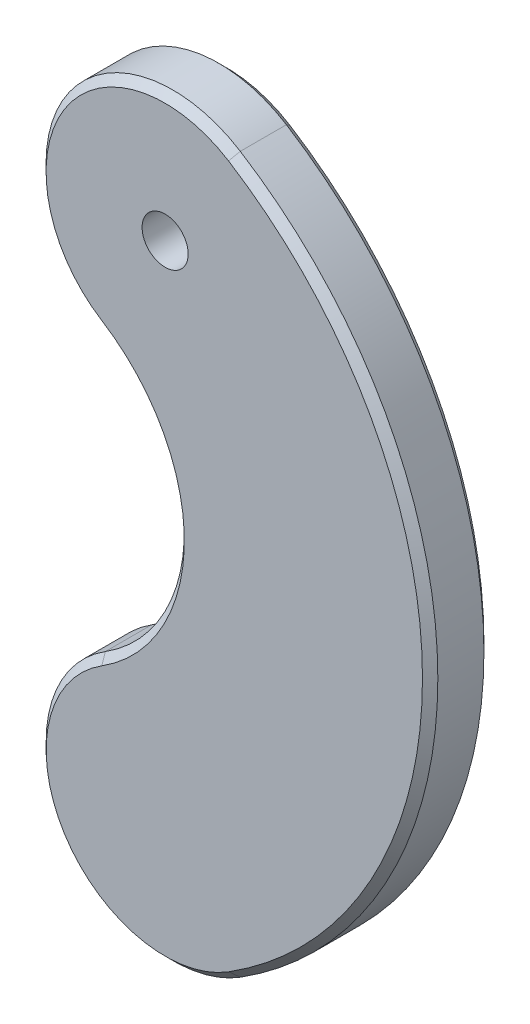
ISO-10303-21;
HEADER;
FILE_DESCRIPTION(('STEP AP214'),'2;1');
FILE_NAME('part.step','',(''),(''),'','','');
FILE_SCHEMA(('AUTOMOTIVE_DESIGN { 1 0 10303 214 1 1 1 1 }'));
ENDSEC;
DATA;
#1=APPLICATION_CONTEXT('core data for automotive mechanical design processes');
#2=APPLICATION_PROTOCOL_DEFINITION('international standard','automotive_design',2000,#1);
#3=PRODUCT_CONTEXT('',#1,'mechanical');
#4=PRODUCT('Part','Part','',(#3));
#5=PRODUCT_RELATED_PRODUCT_CATEGORY('part','',(#4));
#6=PRODUCT_DEFINITION_FORMATION('','',#4);
#7=PRODUCT_DEFINITION_CONTEXT('part definition',#1,'design');
#8=PRODUCT_DEFINITION('design','',#6,#7);
#9=PRODUCT_DEFINITION_SHAPE('','',#8);
#10=(LENGTH_UNIT() NAMED_UNIT(*) SI_UNIT(.MILLI.,.METRE.));
#11=(NAMED_UNIT(*) PLANE_ANGLE_UNIT() SI_UNIT($,.RADIAN.));
#12=(NAMED_UNIT(*) SI_UNIT($,.STERADIAN.) SOLID_ANGLE_UNIT());
#13=UNCERTAINTY_MEASURE_WITH_UNIT(LENGTH_MEASURE(1.E-05),#10,'distance_accuracy_value','');
#14=(GEOMETRIC_REPRESENTATION_CONTEXT(3) GLOBAL_UNCERTAINTY_ASSIGNED_CONTEXT((#13)) GLOBAL_UNIT_ASSIGNED_CONTEXT((#10,
#11,#12)) REPRESENTATION_CONTEXT('',''));
#15=CARTESIAN_POINT('',(0.,0.,0.));
#16=DIRECTION('',(0.,0.,1.));
#17=DIRECTION('',(1.,0.,0.));
#18=AXIS2_PLACEMENT_3D('',#15,#16,#17);
#19=CARTESIAN_POINT('',(10.25,16.2941707368,4.));
#20=DIRECTION('',(0.,0.,-1.));
#21=DIRECTION('',(-1.,0.,0.));
#22=AXIS2_PLACEMENT_3D('',#19,#20,#21);
#23=CYLINDRICAL_SURFACE('',#22,1.5);
#24=CARTESIAN_POINT('',(10.25,16.2941707368,4.));
#25=DIRECTION('',(0.,0.,-1.));
#26=DIRECTION('',(-1.,0.,0.));
#27=AXIS2_PLACEMENT_3D('',#24,#25,#26);
#28=CIRCLE('',#27,1.5);
#29=CARTESIAN_POINT('',(11.75,16.2941707368,4.));
#30=VERTEX_POINT('',#29);
#31=EDGE_CURVE('E117',#30,#30,#28,.T.);
#32=ORIENTED_EDGE('',*,*,#31,.F.);
#33=DIRECTION('',(0.,0.,-1.));
#34=VECTOR('',#33,1.);
#35=CARTESIAN_POINT('',(11.75,16.2941707368,4.));
#36=LINE('',#35,#34);
#37=CARTESIAN_POINT('',(11.75,16.2941707368,0.));
#38=VERTEX_POINT('',#37);
#39=EDGE_CURVE('E11',#30,#38,#36,.T.);
#40=ORIENTED_EDGE('',*,*,#39,.T.);
#41=CARTESIAN_POINT('',(10.25,16.2941707368,0.));
#42=DIRECTION('',(0.,0.,-1.));
#43=DIRECTION('',(-1.,0.,0.));
#44=AXIS2_PLACEMENT_3D('',#41,#42,#43);
#45=CIRCLE('',#44,1.5);
#46=EDGE_CURVE('E238',#38,#38,#45,.T.);
#47=ORIENTED_EDGE('',*,*,#46,.T.);
#48=ORIENTED_EDGE('',*,*,#39,.F.);
#49=EDGE_LOOP('',(#32,#40,#47,#48));
#50=FACE_BOUND('',#49,.T.);
#51=ADVANCED_FACE('F17',(#50),#23,.F.);
#52=CARTESIAN_POINT('',(10.25,16.2941707368,0.));
#53=DIRECTION('',(0.,0.,1.));
#54=DIRECTION('',(-0.846450427593226,0.53246753293252,0.));
#55=AXIS2_PLACEMENT_3D('',#52,#53,#54);
#56=CYLINDRICAL_SURFACE('',#55,8.25);
#57=CARTESIAN_POINT('',(10.25,16.2941707368,3.499996628527));
#58=DIRECTION('',(0.,0.,1.));
#59=DIRECTION('',(0.532467532467523,0.846450427885737,0.));
#60=AXIS2_PLACEMENT_3D('',#57,#58,#59);
#61=CIRCLE('',#60,8.25);
#62=CARTESIAN_POINT('',(14.6428542040345,23.2773820793668,3.49997940906691));
#63=VERTEX_POINT('',#62);
#64=CARTESIAN_POINT('',(5.85714817821987,9.31096316187896,3.50004722792907));
#65=VERTEX_POINT('',#64);
#66=EDGE_CURVE('E387',#63,#65,#61,.T.);
#67=ORIENTED_EDGE('',*,*,#66,.F.);
#68=DIRECTION('',(0.,0.,1.));
#69=VECTOR('',#68,1.);
#70=CARTESIAN_POINT('',(14.64285259594,23.27737951921,0.5000085556156));
#71=LINE('',#70,#69);
#72=CARTESIAN_POINT('',(14.6428528445039,23.2773799108846,0.500021132488038));
#73=VERTEX_POINT('',#72);
#74=EDGE_CURVE('E137',#73,#63,#71,.T.);
#75=ORIENTED_EDGE('',*,*,#74,.F.);
#76=CARTESIAN_POINT('',(10.25,16.2941707368,0.5000033714735));
#77=DIRECTION('',(0.,0.,-1.));
#78=DIRECTION('',(-0.532467532467523,-0.846450427885737,0.));
#79=AXIS2_PLACEMENT_3D('',#76,#77,#78);
#80=CIRCLE('',#79,8.25);
#81=CARTESIAN_POINT('',(5.85715123995501,9.31096803033484,0.499949859291721));
#82=VERTEX_POINT('',#81);
#83=EDGE_CURVE('E263',#82,#73,#80,.T.);
#84=ORIENTED_EDGE('',*,*,#83,.F.);
#85=CARTESIAN_POINT('',(5.85714285827103,9.31095470603303,0.499949859291721));
#86=DIRECTION('',(0.,0.,1.));
#87=VECTOR('',#86,1.);
#88=LINE('',#85,#87);
#89=EDGE_CURVE('E30',#82,#65,#88,.T.);
#90=ORIENTED_EDGE('',*,*,#89,.T.);
#91=EDGE_LOOP('',(#67,#75,#84,#90));
#92=FACE_BOUND('',#91,.T.);
#93=ADVANCED_FACE('F292',(#92),#56,.T.);
#94=CARTESIAN_POINT('',(0.,0.,0.));
#95=DIRECTION('',(0.,0.,1.));
#96=DIRECTION('',(1.,0.,0.));
#97=AXIS2_PLACEMENT_3D('',#94,#95,#96);
#98=CYLINDRICAL_SURFACE('',#97,11.);
#99=CARTESIAN_POINT('',(0.,0.,3.50011608415706));
#100=DIRECTION('',(0.,0.,-1.));
#101=DIRECTION('',(1.,0.,0.));
#102=AXIS2_PLACEMENT_3D('',#99,#100,#101);
#103=CIRCLE('',#102,11.);
#104=CARTESIAN_POINT('',(5.86093817464766,-9.30858474863867,3.50005014070824));
#105=VERTEX_POINT('',#104);
#106=EDGE_CURVE('E394',#65,#105,#103,.T.);
#107=ORIENTED_EDGE('',*,*,#106,.F.);
#108=ORIENTED_EDGE('',*,*,#89,.F.);
#109=CARTESIAN_POINT('',(0.,0.,0.499883915843345));
#110=DIRECTION('',(0.,0.,1.));
#111=DIRECTION('',(1.,0.,0.));
#112=AXIS2_PLACEMENT_3D('',#109,#110,#111);
#113=CIRCLE('',#112,11.);
#114=CARTESIAN_POINT('',(5.86093511103072,-9.30857988136519,0.499952772071436));
#115=VERTEX_POINT('',#114);
#116=EDGE_CURVE('E249',#115,#82,#113,.T.);
#117=ORIENTED_EDGE('',*,*,#116,.F.);
#118=CARTESIAN_POINT('',(5.86092978755584,-9.30857142774017,0.499952772071436));
#119=DIRECTION('',(0.,0.,1.));
#120=VECTOR('',#119,1.);
#121=LINE('',#118,#120);
#122=EDGE_CURVE('E44',#115,#105,#121,.T.);
#123=ORIENTED_EDGE('',*,*,#122,.T.);
#124=EDGE_LOOP('',(#107,#108,#117,#123));
#125=FACE_BOUND('',#124,.T.);
#126=ADVANCED_FACE('F170',(#125),#98,.F.);
#127=CARTESIAN_POINT('',(10.25662712591,-16.29,0.));
#128=DIRECTION('',(0.,0.,1.));
#129=DIRECTION('',(-0.84623376582948,-0.532811799390794,0.));
#130=AXIS2_PLACEMENT_3D('',#127,#128,#129);
#131=CYLINDRICAL_SURFACE('',#130,8.25);
#132=CARTESIAN_POINT('',(10.25662712591,-16.29,3.499996628527));
#133=DIRECTION('',(0.,0.,1.));
#134=DIRECTION('',(-0.532811798748682,0.846233766233772,0.));
#135=AXIS2_PLACEMENT_3D('',#132,#133,#134);
#136=CIRCLE('',#135,8.25);
#137=CARTESIAN_POINT('',(14.6523215273722,-23.2714238835502,3.49997940906608));
#138=VERTEX_POINT('',#137);
#139=EDGE_CURVE('E123',#105,#138,#136,.T.);
#140=ORIENTED_EDGE('',*,*,#139,.F.);
#141=ORIENTED_EDGE('',*,*,#122,.F.);
#142=CARTESIAN_POINT('',(10.25662712591,-16.29,0.5000033714735));
#143=DIRECTION('',(0.,0.,-1.));
#144=DIRECTION('',(0.532811798748682,-0.846233766233772,0.));
#145=AXIS2_PLACEMENT_3D('',#142,#143,#144);
#146=CIRCLE('',#145,8.25);
#147=CARTESIAN_POINT('',(14.6523215273722,-23.2714238835503,0.500020590934281));
#148=VERTEX_POINT('',#147);
#149=EDGE_CURVE('E568',#148,#115,#146,.T.);
#150=ORIENTED_EDGE('',*,*,#149,.F.);
#151=DIRECTION('',(0.,0.,1.));
#152=VECTOR('',#151,1.);
#153=CARTESIAN_POINT('',(14.65231991881,-23.27142132362,0.5000085555515));
#154=LINE('',#153,#152);
#155=EDGE_CURVE('E144',#148,#138,#154,.T.);
#156=ORIENTED_EDGE('',*,*,#155,.T.);
#157=EDGE_LOOP('',(#140,#141,#150,#156));
#158=FACE_BOUND('',#157,.T.);
#159=ADVANCED_FACE('F303',(#158),#131,.T.);
#160=CARTESIAN_POINT('',(10.25662712591,-16.29,3.749996956318));
#161=DIRECTION('',(0.,0.,-1.));
#162=DIRECTION('',(0.,-1.,0.));
#163=AXIS2_PLACEMENT_3D('',#160,#161,#162);
#164=CONICAL_SURFACE('',#163,7.999998154989,0.785397857854175);
#165=CARTESIAN_POINT('',(10.25662712591,-16.29,3.999999209552));
#166=DIRECTION('',(0.,0.,1.));
#167=DIRECTION('',(-0.532811798748682,0.846233766233772,0.));
#168=AXIS2_PLACEMENT_3D('',#165,#166,#167);
#169=CIRCLE('',#168,7.749996054528);
#170=CARTESIAN_POINT('',(6.12730434688443,-9.73163853805096,3.9999820409307));
#171=VERTEX_POINT('',#170);
#172=CARTESIAN_POINT('',(14.3859071611592,-22.848293547325,3.99999209488156));
#173=VERTEX_POINT('',#172);
#174=EDGE_CURVE('E106',#171,#173,#169,.T.);
#175=ORIENTED_EDGE('',*,*,#174,.F.);
#176=CARTESIAN_POINT('',(6.12731649357633,-9.73165782993247,3.99995924362377));
#177=CARTESIAN_POINT('',(6.11621783475806,-9.71403048021645,3.97912887598705));
#178=CARTESIAN_POINT('',(6.10511917594019,-9.69640313050017,3.95829850835032));
#179=CARTESIAN_POINT('',(6.08292185830521,-9.66114843106714,3.91663777307687));
#180=CARTESIAN_POINT('',(6.07182319948812,-9.64352108135037,3.89580740544015));
#181=CARTESIAN_POINT('',(6.0496258818547,-9.60826638191635,3.85414667016669));
#182=CARTESIAN_POINT('',(6.03852722303839,-9.5906390321991,3.83331630252997));
#183=CARTESIAN_POINT('',(6.01632990540654,-9.55538433276409,3.79165556725652));
#184=CARTESIAN_POINT('',(6.00523124659101,-9.53775698304634,3.77082519961979));
#185=CARTESIAN_POINT('',(5.98303392896072,-9.50250228361036,3.72916446434634));
#186=CARTESIAN_POINT('',(5.97193527014596,-9.48487493389212,3.70833409670961));
#187=CARTESIAN_POINT('',(5.94973795251723,-9.44962023445515,3.66667336143616));
#188=CARTESIAN_POINT('',(5.93863929370326,-9.43199288473642,3.64584299379944));
#189=CARTESIAN_POINT('',(5.91644197607609,-9.39673818529847,3.60418225852599));
#190=CARTESIAN_POINT('',(5.9053433172629,-9.37911083557925,3.58335189088926));
#191=CARTESIAN_POINT('',(5.88314599963729,-9.34385613614032,3.54169115561581));
#192=CARTESIAN_POINT('',(5.87204734082488,-9.3262287864206,3.52086078797908));
#193=CARTESIAN_POINT('',(5.86094868201286,-9.30860143670064,3.50003042034236));
#194=B_SPLINE_CURVE_WITH_KNOTS('',3,(#176,#177,#178,#179,#180,#181,#182,#183,#184,#185,#186,
#187,#188,#189,#190,#191,#192,#193),.UNSPECIFIED.,.F.,.F.,(4,2,2,2,2,2,2,2,4),(0.,
0.0883757382606166,0.176751476521233,0.26512721478185,0.353502953042467,0.441878691303085,
0.530254429563701,0.618630167824317,0.707005906084937),.UNSPECIFIED.);
#195=EDGE_CURVE('E398',#171,#105,#194,.T.);
#196=ORIENTED_EDGE('',*,*,#195,.T.);
#197=ORIENTED_EDGE('',*,*,#139,.T.);
#198=CARTESIAN_POINT('',(14.3858983941179,-22.8482796174005,3.99997563580866));
#199=CARTESIAN_POINT('',(14.3969989442736,-22.8659099711675,3.97914168300982));
#200=CARTESIAN_POINT('',(14.408099494429,-22.8835403249347,3.95830773021098));
#201=CARTESIAN_POINT('',(14.4303005947392,-22.9188010324694,3.91663982461329));
#202=CARTESIAN_POINT('',(14.4414011448939,-22.936431386237,3.89580587181445));
#203=CARTESIAN_POINT('',(14.4636022452029,-22.9716920937724,3.85413796621677));
#204=CARTESIAN_POINT('',(14.4747027953571,-22.9893224475403,3.83330401341792));
#205=CARTESIAN_POINT('',(14.4969038956649,-23.0245831550765,3.79163610782024));
#206=CARTESIAN_POINT('',(14.5080044458185,-23.0422135088448,3.7708021550214));
#207=CARTESIAN_POINT('',(14.5302055461251,-23.0774742163817,3.72913424942371));
#208=CARTESIAN_POINT('',(14.5413060962781,-23.0951045701504,3.70830029662487));
#209=CARTESIAN_POINT('',(14.5635071965836,-23.1303652776881,3.66663239102719));
#210=CARTESIAN_POINT('',(14.574607746736,-23.1479956314571,3.64579843822834));
#211=CARTESIAN_POINT('',(14.5968088470403,-23.1832563389956,3.60413053263066));
#212=CARTESIAN_POINT('',(14.6079093971921,-23.200886692765,3.58329657983182));
#213=CARTESIAN_POINT('',(14.6301104974951,-23.2361474003041,3.54162867423413));
#214=CARTESIAN_POINT('',(14.6412110476464,-23.2537777540739,3.52079472143529));
#215=CARTESIAN_POINT('',(14.6523115977973,-23.2714081078439,3.49996076863645));
#216=B_SPLINE_CURVE_WITH_KNOTS('',3,(#198,#199,#200,#201,#202,#203,#204,#205,#206,#207,#208,
#209,#210,#211,#212,#213,#214,#215),.UNSPECIFIED.,.F.,.F.,(4,2,2,2,2,2,2,2,4),(0.,
0.0883908739202648,0.17678174784053,0.265172621760791,0.353563495681054,0.441954369601316,
0.530345243521582,0.618736117441845,0.707126991362107),.UNSPECIFIED.);
#217=EDGE_CURVE('E120',#173,#138,#216,.T.);
#218=ORIENTED_EDGE('',*,*,#217,.F.);
#219=EDGE_LOOP('',(#175,#196,#197,#218));
#220=FACE_BOUND('',#219,.T.);
#221=ADVANCED_FACE('F122',(#220),#164,.T.);
#222=CARTESIAN_POINT('',(0.,0.,3.750059463198));
#223=DIRECTION('',(0.,0.,1.));
#224=DIRECTION('',(0.,-1.,0.));
#225=AXIS2_PLACEMENT_3D('',#222,#223,#224);
#226=CONICAL_SURFACE('',#225,11.24994074139,0.785392886872675);
#227=CARTESIAN_POINT('',(0.,0.,4.));
#228=DIRECTION('',(0.,0.,-1.));
#229=DIRECTION('',(0.,-1.,0.));
#230=AXIS2_PLACEMENT_3D('',#227,#228,#229);
#231=CIRCLE('',#230,11.4998786405711);
#232=CARTESIAN_POINT('',(6.12334713578273,9.73413304498957,4.00000181253893));
#233=VERTEX_POINT('',#232);
#234=EDGE_CURVE('E113',#233,#171,#231,.T.);
#235=ORIENTED_EDGE('',*,*,#234,.F.);
#236=CARTESIAN_POINT('',(6.12333005150004,9.73410588764722,4.00003389647717));
#237=CARTESIAN_POINT('',(6.11223826544563,9.71647355034357,3.97920276123998));
#238=CARTESIAN_POINT('',(6.10114647939083,9.69884121304016,3.95837162600278));
#239=CARTESIAN_POINT('',(6.07896290728048,9.66357653843381,3.91670935552839));
#240=CARTESIAN_POINT('',(6.06787112122492,9.64594420113088,3.89587822029119));
#241=CARTESIAN_POINT('',(6.04568754911305,9.61067952652549,3.8542159498168));
#242=CARTESIAN_POINT('',(6.03459576305673,9.59304718922304,3.83338481457961));
#243=CARTESIAN_POINT('',(6.01241219094333,9.55778251461861,3.79172254410522));
#244=CARTESIAN_POINT('',(6.00132040488625,9.54015017731664,3.77089140886802));
#245=CARTESIAN_POINT('',(5.97913683277132,9.50488550271317,3.72922913839363));
#246=CARTESIAN_POINT('',(5.96804504671348,9.48725316541167,3.70839800315643));
#247=CARTESIAN_POINT('',(5.94586147459703,9.45198849080917,3.66673573268204));
#248=CARTESIAN_POINT('',(5.93476968853842,9.43435615350815,3.64590459744485));
#249=CARTESIAN_POINT('',(5.91258611642045,9.3990914789066,3.60424232697046));
#250=CARTESIAN_POINT('',(5.90149433036108,9.38145914160607,3.58341119173326));
#251=CARTESIAN_POINT('',(5.87931075824158,9.34619446700548,3.54174892125887));
#252=CARTESIAN_POINT('',(5.86821897218145,9.32856212970542,3.52091778602167));
#253=CARTESIAN_POINT('',(5.85712718612094,9.3109297924056,3.50008665078448));
#254=B_SPLINE_CURVE_WITH_KNOTS('',3,(#236,#237,#238,#239,#240,#241,#242,#243,#244,#245,#246,
#247,#248,#249,#250,#251,#252,#253),.UNSPECIFIED.,.F.,.F.,(4,2,2,2,2,2,2,2,4),(0.,
0.0883785555858015,0.176757111171605,0.265135666757407,0.353514222343209,0.441892777929013,
0.530271333514815,0.618649889100617,0.707028444686421),.UNSPECIFIED.);
#255=EDGE_CURVE('E185',#233,#65,#254,.T.);
#256=ORIENTED_EDGE('',*,*,#255,.T.);
#257=ORIENTED_EDGE('',*,*,#106,.T.);
#258=ORIENTED_EDGE('',*,*,#195,.F.);
#259=EDGE_LOOP('',(#235,#256,#257,#258));
#260=FACE_BOUND('',#259,.T.);
#261=ADVANCED_FACE('F168',(#260),#226,.F.);
#262=CARTESIAN_POINT('',(10.25,16.2941707368,3.749996956318));
#263=DIRECTION('',(0.,0.,-1.));
#264=DIRECTION('',(-0.846450427489966,0.532467533096671,0.));
#265=AXIS2_PLACEMENT_3D('',#262,#263,#264);
#266=CONICAL_SURFACE('',#265,7.999998154989,0.785397857854175);
#267=CARTESIAN_POINT('',(10.25,16.2941707368,3.999999209552));
#268=DIRECTION('',(0.,0.,1.));
#269=DIRECTION('',(0.532467532467523,0.846450427885737,0.));
#270=AXIS2_PLACEMENT_3D('',#267,#268,#269);
#271=CIRCLE('',#270,7.749996054528);
#272=CARTESIAN_POINT('',(14.3766119756845,22.8541434093458,3.99999209488091));
#273=VERTEX_POINT('',#272);
#274=EDGE_CURVE('E210',#273,#233,#271,.T.);
#275=ORIENTED_EDGE('',*,*,#274,.F.);
#276=CARTESIAN_POINT('',(14.3766185262482,22.8541538184062,4.00000439362821));
#277=CARTESIAN_POINT('',(14.3877119134314,22.8717887009981,3.97917045848115));
#278=CARTESIAN_POINT('',(14.3988053006138,22.8894235835905,3.95833652333408));
#279=CARTESIAN_POINT('',(14.4209920749767,22.9246933487763,3.91666865303995));
#280=CARTESIAN_POINT('',(14.4320854621574,22.9423282313698,3.89583471789289));
#281=CARTESIAN_POINT('',(14.454272236517,22.9775979965578,3.85416684759876));
#282=CARTESIAN_POINT('',(14.4653656236959,22.9952328791523,3.8333329124517));
#283=CARTESIAN_POINT('',(14.487552398052,23.0305026443424,3.79166504215757));
#284=CARTESIAN_POINT('',(14.4986457852292,23.048137526938,3.7708311070105));
#285=CARTESIAN_POINT('',(14.520832559582,23.0834072921304,3.72916323671638));
#286=CARTESIAN_POINT('',(14.5319259467575,23.101042174727,3.70832930156931));
#287=CARTESIAN_POINT('',(14.5541127211068,23.1363119399215,3.66666143127518));
#288=CARTESIAN_POINT('',(14.5652061082806,23.1539468225193,3.64582749612812));
#289=CARTESIAN_POINT('',(14.5873928826264,23.1892165877159,3.60415962583399));
#290=CARTESIAN_POINT('',(14.5984862697985,23.2068514703147,3.58332569068693));
#291=CARTESIAN_POINT('',(14.6206730441409,23.2421212355135,3.5416578203928));
#292=CARTESIAN_POINT('',(14.6317664313113,23.2597561181134,3.52082388524573));
#293=CARTESIAN_POINT('',(14.6428598184808,23.2773910007139,3.49998995009867));
#294=B_SPLINE_CURVE_WITH_KNOTS('',3,(#276,#277,#278,#279,#280,#281,#282,#283,#284,#285,#286,
#287,#288,#289,#290,#291,#292,#293),.UNSPECIFIED.,.F.,.F.,(4,2,2,2,2,2,2,2,4),(0.,
0.088390873920508,0.176781747841016,0.26517262176152,0.353563495682026,0.441954369602534,
0.530345243523041,0.618736117443547,0.707126991364053),.UNSPECIFIED.);
#295=EDGE_CURVE('E129',#273,#63,#294,.T.);
#296=ORIENTED_EDGE('',*,*,#295,.T.);
#297=ORIENTED_EDGE('',*,*,#66,.T.);
#298=ORIENTED_EDGE('',*,*,#255,.F.);
#299=EDGE_LOOP('',(#275,#296,#297,#298));
#300=FACE_BOUND('',#299,.T.);
#301=ADVANCED_FACE('F158',(#300),#266,.T.);
#302=CARTESIAN_POINT('',(0.,0.,4.));
#303=DIRECTION('',(0.,0.,1.));
#304=DIRECTION('',(1.,0.,0.));
#305=AXIS2_PLACEMENT_3D('',#302,#303,#304);
#306=PLANE('',#305);
#307=ORIENTED_EDGE('',*,*,#31,.T.);
#308=EDGE_LOOP('',(#307));
#309=FACE_BOUND('',#308,.T.);
#310=ORIENTED_EDGE('',*,*,#274,.T.);
#311=ORIENTED_EDGE('',*,*,#234,.T.);
#312=ORIENTED_EDGE('',*,*,#174,.T.);
#313=CARTESIAN_POINT('',(-1.172395514004E-13,0.,4.));
#314=DIRECTION('',(0.,0.,1.));
#315=DIRECTION('',(0.,-1.,0.));
#316=AXIS2_PLACEMENT_3D('',#313,#314,#315);
#317=CIRCLE('',#316,26.9999377484459);
#318=EDGE_CURVE('E111',#173,#273,#317,.T.);
#319=ORIENTED_EDGE('',*,*,#318,.T.);
#320=EDGE_LOOP('',(#310,#311,#312,#319));
#321=FACE_BOUND('',#320,.T.);
#322=ADVANCED_FACE('F109',(#309,#321),#306,.T.);
#323=CARTESIAN_POINT('',(-1.172395514004E-13,0.,3.7499685015));
#324=DIRECTION('',(0.,0.,-1.));
#325=DIRECTION('',(0.,-1.,0.));
#326=AXIS2_PLACEMENT_3D('',#323,#324,#325);
#327=CONICAL_SURFACE('',#326,27.24996867047,0.785397010589675);
#328=ORIENTED_EDGE('',*,*,#318,.F.);
#329=ORIENTED_EDGE('',*,*,#217,.T.);
#330=CARTESIAN_POINT('',(0.,0.,3.49993659549322));
#331=DIRECTION('',(0.,0.,1.));
#332=DIRECTION('',(1.,0.,0.));
#333=AXIS2_PLACEMENT_3D('',#330,#331,#332);
#334=CIRCLE('',#333,27.5);
#335=EDGE_CURVE('E436',#138,#63,#334,.T.);
#336=ORIENTED_EDGE('',*,*,#335,.T.);
#337=ORIENTED_EDGE('',*,*,#295,.F.);
#338=EDGE_LOOP('',(#328,#329,#336,#337));
#339=FACE_BOUND('',#338,.T.);
#340=ADVANCED_FACE('F133',(#339),#327,.T.);
#341=CARTESIAN_POINT('',(0.,0.,0.));
#342=DIRECTION('',(0.,0.,1.));
#343=DIRECTION('',(1.,0.,0.));
#344=AXIS2_PLACEMENT_3D('',#341,#342,#343);
#345=CYLINDRICAL_SURFACE('',#344,27.5);
#346=ORIENTED_EDGE('',*,*,#335,.F.);
#347=ORIENTED_EDGE('',*,*,#155,.F.);
#348=CARTESIAN_POINT('',(0.,0.,0.500063404506881));
#349=DIRECTION('',(0.,0.,-1.));
#350=DIRECTION('',(1.,0.,0.));
#351=AXIS2_PLACEMENT_3D('',#348,#349,#350);
#352=CIRCLE('',#351,27.5);
#353=EDGE_CURVE('E441',#73,#148,#352,.T.);
#354=ORIENTED_EDGE('',*,*,#353,.F.);
#355=ORIENTED_EDGE('',*,*,#74,.T.);
#356=EDGE_LOOP('',(#346,#347,#354,#355));
#357=FACE_BOUND('',#356,.T.);
#358=ADVANCED_FACE('F283',(#357),#345,.T.);
#359=CARTESIAN_POINT('',(0.,0.,0.2500314985001));
#360=DIRECTION('',(0.,0.,1.));
#361=DIRECTION('',(0.,-1.,0.));
#362=AXIS2_PLACEMENT_3D('',#359,#360,#361);
#363=CONICAL_SURFACE('',#362,27.24996867047,0.785397010589675);
#364=CARTESIAN_POINT('',(0.,0.,0.));
#365=DIRECTION('',(0.,0.,-1.));
#366=DIRECTION('',(0.,-1.,0.));
#367=AXIS2_PLACEMENT_3D('',#364,#365,#366);
#368=CIRCLE('',#367,26.9999377484457);
#369=CARTESIAN_POINT('',(14.3766113668295,22.8541424316728,1.15292168099835E-05));
#370=VERTEX_POINT('',#369);
#371=CARTESIAN_POINT('',(14.3859065535221,-22.8482925688803,1.1529215428015E-05));
#372=VERTEX_POINT('',#371);
#373=EDGE_CURVE('E244',#370,#372,#368,.T.);
#374=ORIENTED_EDGE('',*,*,#373,.F.);
#375=CARTESIAN_POINT('',(14.3766038718306,22.8541305226423,2.56003569060214E-05));
#376=CARTESIAN_POINT('',(14.3876971997994,22.8717653111139,0.0208594596096476));
#377=CARTESIAN_POINT('',(14.398790527768,22.8894000995857,0.0416933188623892));
#378=CARTESIAN_POINT('',(14.4209771837048,22.9246696765296,0.0833610373678724));
#379=CARTESIAN_POINT('',(14.432070511673,22.9423044650016,0.104194896620614));
#380=CARTESIAN_POINT('',(14.454257167609,22.977574041946,0.145862615126097));
#381=CARTESIAN_POINT('',(14.4653504955767,22.9952088304184,0.166696474378838));
#382=CARTESIAN_POINT('',(14.4875371515119,23.0304784073633,0.208364192884321));
#383=CARTESIAN_POINT('',(14.4986304794792,23.0481131958359,0.229198052137063));
#384=CARTESIAN_POINT('',(14.5208171354135,23.0833827727813,0.270865770642546));
#385=CARTESIAN_POINT('',(14.5319104633804,23.1010175612542,0.291699629895287));
#386=CARTESIAN_POINT('',(14.5540971193139,23.1362871382001,0.33336734840077));
#387=CARTESIAN_POINT('',(14.5651904472804,23.1539219266732,0.354201207653512));
#388=CARTESIAN_POINT('',(14.587377103213,23.1891915036197,0.395868926158995));
#389=CARTESIAN_POINT('',(14.5984704311791,23.2068262920931,0.416702785411736));
#390=CARTESIAN_POINT('',(14.6206570871108,23.2420958690402,0.458370503917219));
#391=CARTESIAN_POINT('',(14.6317504150765,23.2597306575138,0.479204363169961));
#392=CARTESIAN_POINT('',(14.642843743042,23.2773654459876,0.500038222422702));
#393=B_SPLINE_CURVE_WITH_KNOTS('',3,(#375,#376,#377,#378,#379,#380,#381,#382,#383,#384,#385,
#386,#387,#388,#389,#390,#391,#392),.UNSPECIFIED.,.F.,.F.,(4,2,2,2,2,2,2,2,4),(0.,
0.0883904770382259,0.176780954076454,0.265171431114682,0.353561908152908,0.441952385191138,
0.530342862229365,0.618733339267592,0.707123816305818),.UNSPECIFIED.);
#394=EDGE_CURVE('E405',#370,#73,#393,.T.);
#395=ORIENTED_EDGE('',*,*,#394,.T.);
#396=ORIENTED_EDGE('',*,*,#353,.T.);
#397=CARTESIAN_POINT('',(14.3859143752926,-22.8483049993641,-3.15746743605617E-06));
#398=CARTESIAN_POINT('',(14.3970149074173,-22.8659353244775,0.0208307261729411));
#399=CARTESIAN_POINT('',(14.4081154395408,-22.8835656495917,0.0416646098133196));
#400=CARTESIAN_POINT('',(14.4303165037855,-22.9188262998215,0.0833323770940766));
#401=CARTESIAN_POINT('',(14.4414170359066,-22.9364566249372,0.104166260734455));
#402=CARTESIAN_POINT('',(14.4636181001464,-22.9717172751701,0.145834028015211));
#403=CARTESIAN_POINT('',(14.4747186322651,-22.9893476002872,0.166667911655589));
#404=CARTESIAN_POINT('',(14.4969196965001,-23.0246082505231,0.208335678936345));
#405=CARTESIAN_POINT('',(14.5080202286164,-23.0422385756418,0.229169562576723));
#406=CARTESIAN_POINT('',(14.5302212928466,-23.0774992258807,0.27083732985748));
#407=CARTESIAN_POINT('',(14.5413218249605,-23.0951295510009,0.291671213497858));
#408=CARTESIAN_POINT('',(14.5635228891859,-23.1303902012429,0.333338980778614));
#409=CARTESIAN_POINT('',(14.5746234212974,-23.1480205263646,0.354172864418992));
#410=CARTESIAN_POINT('',(14.596824485518,-23.1832811766096,0.395840631699748));
#411=CARTESIAN_POINT('',(14.6079250176271,-23.2009115017328,0.416674515340127));
#412=CARTESIAN_POINT('',(14.6301260818429,-23.2361721519808,0.458342282620884));
#413=CARTESIAN_POINT('',(14.6412266139496,-23.2538024771055,0.479176166261262));
#414=CARTESIAN_POINT('',(14.6523271460551,-23.271432802231,0.500010049901639));
#415=B_SPLINE_CURVE_WITH_KNOTS('',3,(#397,#398,#399,#400,#401,#402,#403,#404,#405,#406,#407,
#408,#409,#410,#411,#412,#413,#414),.UNSPECIFIED.,.F.,.F.,(4,2,2,2,2,2,2,2,4),(0.,
0.0883906553962114,0.176781310792421,0.265171966188633,0.353562621584844,0.441953276981055,
0.530343932377267,0.618734587773476,0.707125243169688),.UNSPECIFIED.);
#416=EDGE_CURVE('E243',#372,#148,#415,.T.);
#417=ORIENTED_EDGE('',*,*,#416,.F.);
#418=EDGE_LOOP('',(#374,#395,#396,#417));
#419=FACE_BOUND('',#418,.T.);
#420=ADVANCED_FACE('F19',(#419),#363,.T.);
#421=CARTESIAN_POINT('',(10.25,16.2941707368,0.2500030436817));
#422=DIRECTION('',(0.,0.,1.));
#423=DIRECTION('',(-0.846450427489966,0.532467533096671,0.));
#424=AXIS2_PLACEMENT_3D('',#421,#422,#423);
#425=CONICAL_SURFACE('',#424,7.999998154989,0.785397857854175);
#426=CARTESIAN_POINT('',(10.25,16.2941707368,7.904479257803E-07));
#427=DIRECTION('',(0.,0.,-1.));
#428=DIRECTION('',(-0.532467532467523,-0.846450427885737,0.));
#429=AXIS2_PLACEMENT_3D('',#426,#427,#428);
#430=CIRCLE('',#429,7.749996054528);
#431=CARTESIAN_POINT('',(6.12334530431015,9.73413013467697,1.79590677302237E-05));
#432=VERTEX_POINT('',#431);
#433=EDGE_CURVE('E473',#432,#370,#430,.T.);
#434=ORIENTED_EDGE('',*,*,#433,.F.);
#435=CARTESIAN_POINT('',(6.12335744316237,9.73414943149323,4.07563754204463E-05));
#436=CARTESIAN_POINT('',(6.11226595554808,9.71651756862853,0.0208711240121987));
#437=CARTESIAN_POINT('',(6.10117446793431,9.6988857057635,0.0417014916489773));
#438=CARTESIAN_POINT('',(6.07899149270783,9.66362198003278,0.0833622269225345));
#439=CARTESIAN_POINT('',(6.06790000509511,9.64599011716709,0.104192594559313));
#440=CARTESIAN_POINT('',(6.04571702987073,9.61072639143504,0.14585332983287));
#441=CARTESIAN_POINT('',(6.03462554225906,9.59309452856869,0.166683697469648));
#442=CARTESIAN_POINT('',(6.01244256703678,9.55783080283532,0.208344432743205));
#443=CARTESIAN_POINT('',(6.00135107942616,9.54019893996831,0.229174800379984));
#444=CARTESIAN_POINT('',(5.97916810420598,9.50493521423362,0.270835535653541));
#445=CARTESIAN_POINT('',(5.96807661659642,9.48730335136595,0.29166590329032));
#446=CARTESIAN_POINT('',(5.94589364137834,9.45203962562994,0.333326638563877));
#447=CARTESIAN_POINT('',(5.93480215376982,9.43440776276161,0.354157006200655));
#448=CARTESIAN_POINT('',(5.91261917855384,9.39914403702427,0.395817741474212));
#449=CARTESIAN_POINT('',(5.90152769094638,9.38151217415528,0.41664810911099));
#450=CARTESIAN_POINT('',(5.8793447157325,9.34624844841662,0.458308844384548));
#451=CARTESIAN_POINT('',(5.86825322812609,9.32861658554697,0.479139212021326));
#452=CARTESIAN_POINT('',(5.8571617405202,9.31098472267698,0.499969579658104));
#453=B_SPLINE_CURVE_WITH_KNOTS('',3,(#435,#436,#437,#438,#439,#440,#441,#442,#443,#444,#445,
#446,#447,#448,#449,#450,#451,#452),.UNSPECIFIED.,.F.,.F.,(4,2,2,2,2,2,2,2,4),(0.,
0.0883757382608407,0.176751476521681,0.265127214782523,0.353502953043364,0.441878691304204,
0.530254429565046,0.618630167825887,0.707005906086728),.UNSPECIFIED.);
#454=EDGE_CURVE('E254',#432,#82,#453,.T.);
#455=ORIENTED_EDGE('',*,*,#454,.T.);
#456=ORIENTED_EDGE('',*,*,#83,.T.);
#457=ORIENTED_EDGE('',*,*,#394,.F.);
#458=EDGE_LOOP('',(#434,#455,#456,#457));
#459=FACE_BOUND('',#458,.T.);
#460=ADVANCED_FACE('F200',(#459),#425,.T.);
#461=CARTESIAN_POINT('',(0.,0.,0.2499405368024));
#462=DIRECTION('',(0.,0.,-1.));
#463=DIRECTION('',(0.,-1.,0.));
#464=AXIS2_PLACEMENT_3D('',#461,#462,#463);
#465=CONICAL_SURFACE('',#464,11.24994074139,0.785392886872675);
#466=CARTESIAN_POINT('',(0.,0.,0.));
#467=DIRECTION('',(0.,0.,1.));
#468=DIRECTION('',(0.,-1.,0.));
#469=AXIS2_PLACEMENT_3D('',#466,#467,#468);
#470=CIRCLE('',#469,11.4998786405715);
#471=CARTESIAN_POINT('',(6.12730617895077,-9.73164144799015,-1.81253896443939E-06));
#472=VERTEX_POINT('',#471);
#473=EDGE_CURVE('E479',#472,#432,#470,.T.);
#474=ORIENTED_EDGE('',*,*,#473,.F.);
#475=CARTESIAN_POINT('',(6.12728908420481,-9.7316142972334,-3.38964767925172E-05));
#476=CARTESIAN_POINT('',(6.11619012675165,-9.71398647320091,0.020797238760428));
#477=CARTESIAN_POINT('',(6.1050911692982,-9.6963586491686,0.041628373997648));
#478=CARTESIAN_POINT('',(6.08289325439069,-9.66110300110436,0.0832906444720879));
#479=CARTESIAN_POINT('',(6.07179429693664,-9.64347517707242,0.104121779709308));
#480=CARTESIAN_POINT('',(6.04959638202796,-9.60821952900892,0.145784050183748));
#481=CARTESIAN_POINT('',(6.03849742457333,-9.59059170497735,0.166615185420968));
#482=CARTESIAN_POINT('',(6.01629950966346,-9.55533605691459,0.208277455895408));
#483=CARTESIAN_POINT('',(6.00520055220823,-9.5377082328834,0.229108591132628));
#484=CARTESIAN_POINT('',(5.98300263729719,-9.50245258482138,0.270770861607068));
#485=CARTESIAN_POINT('',(5.97190367984138,-9.48482476079055,0.291601996844289));
#486=CARTESIAN_POINT('',(5.94970576492917,-9.44956911272928,0.333264267318729));
#487=CARTESIAN_POINT('',(5.93860680747276,-9.43194128869882,0.354095402555949));
#488=CARTESIAN_POINT('',(5.91640889255937,-9.39668564063829,0.395757673030389));
#489=CARTESIAN_POINT('',(5.90530993510238,-9.3790578166082,0.416588808267609));
#490=CARTESIAN_POINT('',(5.8831120201878,-9.34380216854841,0.458251078742049));
#491=CARTESIAN_POINT('',(5.87201306273022,-9.3261743445187,0.479082213979269));
#492=CARTESIAN_POINT('',(5.86091410527234,-9.30854652048918,0.49991334921649));
#493=B_SPLINE_CURVE_WITH_KNOTS('',3,(#475,#476,#477,#478,#479,#480,#481,#482,#483,#484,#485,
#486,#487,#488,#489,#490,#491,#492),.UNSPECIFIED.,.F.,.F.,(4,2,2,2,2,2,2,2,4),(0.,
0.0883785555859059,0.176757111171813,0.26513566675772,0.353514222343626,0.441892777929533,
0.530271333515439,0.618649889101346,0.707028444687252),.UNSPECIFIED.);
#494=EDGE_CURVE('E255',#472,#115,#493,.T.);
#495=ORIENTED_EDGE('',*,*,#494,.T.);
#496=ORIENTED_EDGE('',*,*,#116,.T.);
#497=ORIENTED_EDGE('',*,*,#454,.F.);
#498=EDGE_LOOP('',(#474,#495,#496,#497));
#499=FACE_BOUND('',#498,.T.);
#500=ADVANCED_FACE('F277',(#499),#465,.F.);
#501=CARTESIAN_POINT('',(10.25662712591,-16.29,0.2500030436817));
#502=DIRECTION('',(0.,0.,1.));
#503=DIRECTION('',(0.,-1.,0.));
#504=AXIS2_PLACEMENT_3D('',#501,#502,#503);
#505=CONICAL_SURFACE('',#504,7.999998154989,0.785397857854175);
#506=CARTESIAN_POINT('',(10.25662712591,-16.29,7.904479284448E-07));
#507=DIRECTION('',(0.,0.,-1.));
#508=DIRECTION('',(0.532811798748682,-0.846233766233772,0.));
#509=AXIS2_PLACEMENT_3D('',#506,#507,#508);
#510=CIRCLE('',#509,7.749996054528);
#511=EDGE_CURVE('E506',#372,#472,#510,.T.);
#512=ORIENTED_EDGE('',*,*,#511,.F.);
#513=ORIENTED_EDGE('',*,*,#416,.T.);
#514=ORIENTED_EDGE('',*,*,#149,.T.);
#515=ORIENTED_EDGE('',*,*,#494,.F.);
#516=EDGE_LOOP('',(#512,#513,#514,#515));
#517=FACE_BOUND('',#516,.T.);
#518=ADVANCED_FACE('F319',(#517),#505,.T.);
#519=CARTESIAN_POINT('',(0.,0.,0.));
#520=DIRECTION('',(0.,0.,1.));
#521=DIRECTION('',(1.,0.,0.));
#522=AXIS2_PLACEMENT_3D('',#519,#520,#521);
#523=PLANE('',#522);
#524=ORIENTED_EDGE('',*,*,#46,.F.);
#525=EDGE_LOOP('',(#524));
#526=FACE_BOUND('',#525,.T.);
#527=ORIENTED_EDGE('',*,*,#511,.T.);
#528=ORIENTED_EDGE('',*,*,#473,.T.);
#529=ORIENTED_EDGE('',*,*,#433,.T.);
#530=ORIENTED_EDGE('',*,*,#373,.T.);
#531=EDGE_LOOP('',(#527,#528,#529,#530));
#532=FACE_BOUND('',#531,.T.);
#533=ADVANCED_FACE('F324',(#526,#532),#523,.F.);
#534=CLOSED_SHELL('',(#51,#93,#126,#159,#221,#261,#301,#322,#340,#358,#420,#460,#500,#518,#533));
#535=MANIFOLD_SOLID_BREP('B1',#534);
#536=ADVANCED_BREP_SHAPE_REPRESENTATION('',(#18,#535),#14);
#537=SHAPE_DEFINITION_REPRESENTATION(#9,#536);
ENDSEC;
END-ISO-10303-21;
